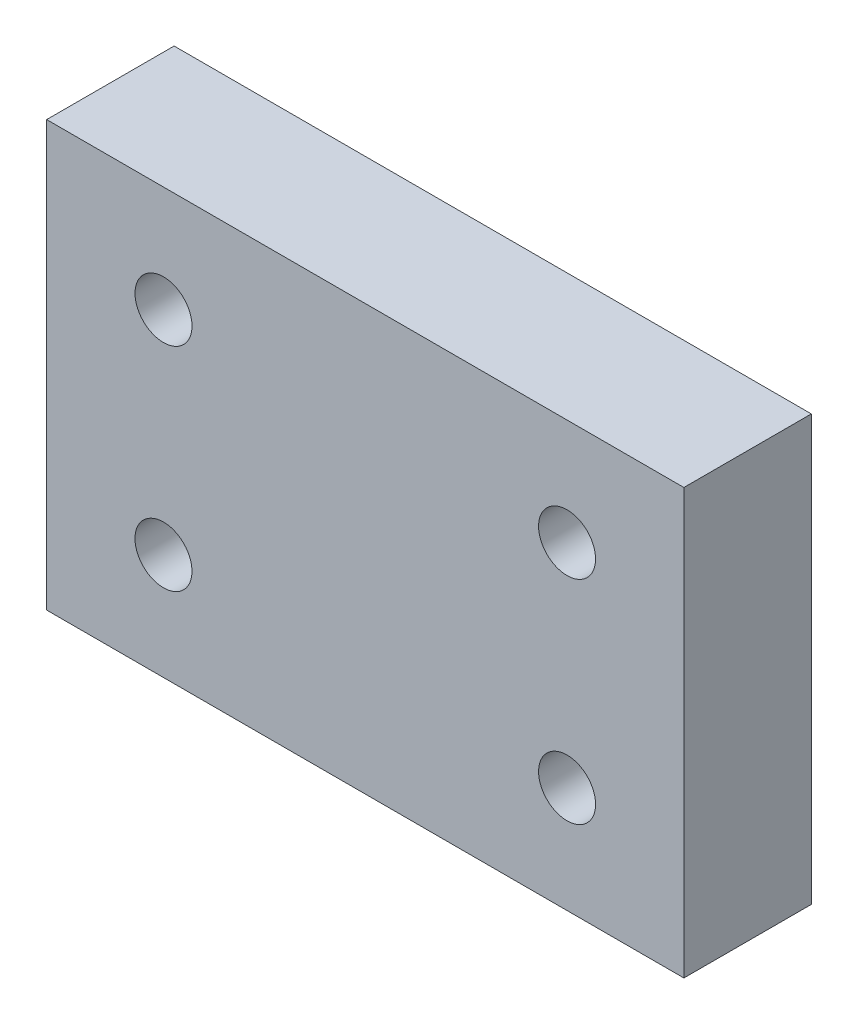
ISO-10303-21;
HEADER;
FILE_DESCRIPTION(('STEP AP214'),'2;1');
FILE_NAME('part.step','',(''),(''),'','','');
FILE_SCHEMA(('AUTOMOTIVE_DESIGN { 1 0 10303 214 1 1 1 1 }'));
ENDSEC;
DATA;
#1=APPLICATION_CONTEXT('core data for automotive mechanical design processes');
#2=APPLICATION_PROTOCOL_DEFINITION('international standard','automotive_design',2000,#1);
#3=PRODUCT_CONTEXT('',#1,'mechanical');
#4=PRODUCT('Part','Part','',(#3));
#5=PRODUCT_RELATED_PRODUCT_CATEGORY('part','',(#4));
#6=PRODUCT_DEFINITION_FORMATION('','',#4);
#7=PRODUCT_DEFINITION_CONTEXT('part definition',#1,'design');
#8=PRODUCT_DEFINITION('design','',#6,#7);
#9=PRODUCT_DEFINITION_SHAPE('','',#8);
#10=(LENGTH_UNIT() NAMED_UNIT(*) SI_UNIT(.MILLI.,.METRE.));
#11=(NAMED_UNIT(*) PLANE_ANGLE_UNIT() SI_UNIT($,.RADIAN.));
#12=(NAMED_UNIT(*) SI_UNIT($,.STERADIAN.) SOLID_ANGLE_UNIT());
#13=UNCERTAINTY_MEASURE_WITH_UNIT(LENGTH_MEASURE(1.E-05),#10,'distance_accuracy_value','');
#14=(GEOMETRIC_REPRESENTATION_CONTEXT(3) GLOBAL_UNCERTAINTY_ASSIGNED_CONTEXT((#13)) GLOBAL_UNIT_ASSIGNED_CONTEXT((#10,
#11,#12)) REPRESENTATION_CONTEXT('',''));
#15=CARTESIAN_POINT('',(0.,0.,0.));
#16=DIRECTION('',(0.,0.,1.));
#17=DIRECTION('',(1.,0.,0.));
#18=AXIS2_PLACEMENT_3D('',#15,#16,#17);
#19=CARTESIAN_POINT('',(0.,0.,6.));
#20=DIRECTION('',(0.,0.,-1.));
#21=DIRECTION('',(-1.,0.,0.));
#22=AXIS2_PLACEMENT_3D('',#19,#20,#21);
#23=PLANE('',#22);
#24=CARTESIAN_POINT('',(24.5,5.,6.));
#25=DIRECTION('',(0.,0.,1.));
#26=DIRECTION('',(1.,0.,0.));
#27=AXIS2_PLACEMENT_3D('',#24,#25,#26);
#28=CIRCLE('',#27,1.34180855128207);
#29=CARTESIAN_POINT('',(25.8418085512821,5.,6.));
#30=VERTEX_POINT('',#29);
#31=EDGE_CURVE('E121',#30,#30,#28,.T.);
#32=ORIENTED_EDGE('',*,*,#31,.F.);
#33=EDGE_LOOP('',(#32));
#34=FACE_BOUND('',#33,.T.);
#35=CARTESIAN_POINT('',(5.5,15.,6.));
#36=DIRECTION('',(0.,0.,1.));
#37=DIRECTION('',(1.,0.,0.));
#38=AXIS2_PLACEMENT_3D('',#35,#36,#37);
#39=CIRCLE('',#38,1.34180855128207);
#40=CARTESIAN_POINT('',(6.84180855128207,15.,6.));
#41=VERTEX_POINT('',#40);
#42=EDGE_CURVE('E100',#41,#41,#39,.T.);
#43=ORIENTED_EDGE('',*,*,#42,.F.);
#44=EDGE_LOOP('',(#43));
#45=FACE_BOUND('',#44,.T.);
#46=DIRECTION('',(0.,-1.,0.));
#47=VECTOR('',#46,1.);
#48=CARTESIAN_POINT('',(0.,0.,6.));
#49=LINE('',#48,#47);
#50=CARTESIAN_POINT('',(0.,20.,6.));
#51=VERTEX_POINT('',#50);
#52=CARTESIAN_POINT('',(0.,0.,6.));
#53=VERTEX_POINT('',#52);
#54=EDGE_CURVE('E85',#51,#53,#49,.T.);
#55=ORIENTED_EDGE('',*,*,#54,.T.);
#56=DIRECTION('',(1.,0.,0.));
#57=VECTOR('',#56,1.);
#58=CARTESIAN_POINT('',(0.,0.,6.));
#59=LINE('',#58,#57);
#60=CARTESIAN_POINT('',(30.,0.,6.));
#61=VERTEX_POINT('',#60);
#62=EDGE_CURVE('E80',#53,#61,#59,.T.);
#63=ORIENTED_EDGE('',*,*,#62,.T.);
#64=DIRECTION('',(0.,1.,0.));
#65=VECTOR('',#64,1.);
#66=CARTESIAN_POINT('',(30.,0.,6.));
#67=LINE('',#66,#65);
#68=CARTESIAN_POINT('',(30.,20.,6.));
#69=VERTEX_POINT('',#68);
#70=EDGE_CURVE('E83',#61,#69,#67,.T.);
#71=ORIENTED_EDGE('',*,*,#70,.T.);
#72=DIRECTION('',(-1.,0.,0.));
#73=VECTOR('',#72,1.);
#74=CARTESIAN_POINT('',(0.,20.,6.));
#75=LINE('',#74,#73);
#76=EDGE_CURVE('E50',#69,#51,#75,.T.);
#77=ORIENTED_EDGE('',*,*,#76,.T.);
#78=EDGE_LOOP('',(#55,#63,#71,#77));
#79=FACE_BOUND('',#78,.T.);
#80=CARTESIAN_POINT('',(24.5,15.,6.));
#81=DIRECTION('',(0.,0.,1.));
#82=DIRECTION('',(-1.,0.,0.));
#83=AXIS2_PLACEMENT_3D('',#80,#81,#82);
#84=CIRCLE('',#83,1.34180855128207);
#85=CARTESIAN_POINT('',(23.1581914487179,15.,6.));
#86=VERTEX_POINT('',#85);
#87=EDGE_CURVE('E115',#86,#86,#84,.T.);
#88=ORIENTED_EDGE('',*,*,#87,.F.);
#89=EDGE_LOOP('',(#88));
#90=FACE_BOUND('',#89,.T.);
#91=CARTESIAN_POINT('',(5.5,5.,6.));
#92=DIRECTION('',(0.,0.,1.));
#93=DIRECTION('',(-1.,0.,0.));
#94=AXIS2_PLACEMENT_3D('',#91,#92,#93);
#95=CIRCLE('',#94,1.34180855128207);
#96=CARTESIAN_POINT('',(4.15819144871793,5.,6.));
#97=VERTEX_POINT('',#96);
#98=EDGE_CURVE('E127',#97,#97,#95,.T.);
#99=ORIENTED_EDGE('',*,*,#98,.F.);
#100=EDGE_LOOP('',(#99));
#101=FACE_BOUND('',#100,.T.);
#102=ADVANCED_FACE('F33',(#34,#45,#79,#90,#101),#23,.F.);
#103=CARTESIAN_POINT('',(0.,0.,0.));
#104=DIRECTION('',(0.,0.,-1.));
#105=DIRECTION('',(-1.,0.,0.));
#106=AXIS2_PLACEMENT_3D('',#103,#104,#105);
#107=PLANE('',#106);
#108=CARTESIAN_POINT('',(24.5,5.,0.));
#109=DIRECTION('',(0.,0.,1.));
#110=DIRECTION('',(1.,0.,0.));
#111=AXIS2_PLACEMENT_3D('',#108,#109,#110);
#112=CIRCLE('',#111,1.34180855128207);
#113=CARTESIAN_POINT('',(25.8418085512821,5.,0.));
#114=VERTEX_POINT('',#113);
#115=EDGE_CURVE('E124',#114,#114,#112,.T.);
#116=ORIENTED_EDGE('',*,*,#115,.T.);
#117=EDGE_LOOP('',(#116));
#118=FACE_BOUND('',#117,.T.);
#119=CARTESIAN_POINT('',(5.5,15.,0.));
#120=DIRECTION('',(0.,0.,1.));
#121=DIRECTION('',(1.,0.,0.));
#122=AXIS2_PLACEMENT_3D('',#119,#120,#121);
#123=CIRCLE('',#122,1.34180855128207);
#124=CARTESIAN_POINT('',(6.84180855128207,15.,0.));
#125=VERTEX_POINT('',#124);
#126=EDGE_CURVE('E112',#125,#125,#123,.T.);
#127=ORIENTED_EDGE('',*,*,#126,.T.);
#128=EDGE_LOOP('',(#127));
#129=FACE_BOUND('',#128,.T.);
#130=DIRECTION('',(0.,-1.,0.));
#131=VECTOR('',#130,1.);
#132=CARTESIAN_POINT('',(0.,0.,0.));
#133=LINE('',#132,#131);
#134=CARTESIAN_POINT('',(0.,20.,0.));
#135=VERTEX_POINT('',#134);
#136=CARTESIAN_POINT('',(0.,0.,0.));
#137=VERTEX_POINT('',#136);
#138=EDGE_CURVE('E97',#135,#137,#133,.T.);
#139=ORIENTED_EDGE('',*,*,#138,.F.);
#140=DIRECTION('',(-1.,0.,0.));
#141=VECTOR('',#140,1.);
#142=CARTESIAN_POINT('',(0.,20.,0.));
#143=LINE('',#142,#141);
#144=CARTESIAN_POINT('',(30.,20.,0.));
#145=VERTEX_POINT('',#144);
#146=EDGE_CURVE('E73',#145,#135,#143,.T.);
#147=ORIENTED_EDGE('',*,*,#146,.F.);
#148=DIRECTION('',(0.,1.,0.));
#149=VECTOR('',#148,1.);
#150=CARTESIAN_POINT('',(30.,0.,0.));
#151=LINE('',#150,#149);
#152=CARTESIAN_POINT('',(30.,0.,0.));
#153=VERTEX_POINT('',#152);
#154=EDGE_CURVE('E67',#153,#145,#151,.T.);
#155=ORIENTED_EDGE('',*,*,#154,.F.);
#156=DIRECTION('',(1.,0.,0.));
#157=VECTOR('',#156,1.);
#158=CARTESIAN_POINT('',(0.,0.,0.));
#159=LINE('',#158,#157);
#160=EDGE_CURVE('E89',#137,#153,#159,.T.);
#161=ORIENTED_EDGE('',*,*,#160,.F.);
#162=EDGE_LOOP('',(#139,#147,#155,#161));
#163=FACE_BOUND('',#162,.T.);
#164=CARTESIAN_POINT('',(24.5,15.,0.));
#165=DIRECTION('',(0.,0.,1.));
#166=DIRECTION('',(-1.,0.,0.));
#167=AXIS2_PLACEMENT_3D('',#164,#165,#166);
#168=CIRCLE('',#167,1.34180855128207);
#169=CARTESIAN_POINT('',(23.1581914487179,15.,0.));
#170=VERTEX_POINT('',#169);
#171=EDGE_CURVE('E118',#170,#170,#168,.T.);
#172=ORIENTED_EDGE('',*,*,#171,.T.);
#173=EDGE_LOOP('',(#172));
#174=FACE_BOUND('',#173,.T.);
#175=CARTESIAN_POINT('',(5.5,5.,0.));
#176=DIRECTION('',(0.,0.,1.));
#177=DIRECTION('',(-1.,0.,0.));
#178=AXIS2_PLACEMENT_3D('',#175,#176,#177);
#179=CIRCLE('',#178,1.34180855128207);
#180=CARTESIAN_POINT('',(4.15819144871793,5.,0.));
#181=VERTEX_POINT('',#180);
#182=EDGE_CURVE('E130',#181,#181,#179,.T.);
#183=ORIENTED_EDGE('',*,*,#182,.T.);
#184=EDGE_LOOP('',(#183));
#185=FACE_BOUND('',#184,.T.);
#186=ADVANCED_FACE('F108',(#118,#129,#163,#174,#185),#107,.T.);
#187=CARTESIAN_POINT('',(0.,0.,6.));
#188=DIRECTION('',(1.,0.,0.));
#189=DIRECTION('',(0.,0.,-1.));
#190=AXIS2_PLACEMENT_3D('',#187,#188,#189);
#191=PLANE('',#190);
#192=ORIENTED_EDGE('',*,*,#138,.T.);
#193=DIRECTION('',(0.,0.,-1.));
#194=VECTOR('',#193,1.);
#195=CARTESIAN_POINT('',(0.,0.,6.));
#196=LINE('',#195,#194);
#197=EDGE_CURVE('E11',#53,#137,#196,.T.);
#198=ORIENTED_EDGE('',*,*,#197,.F.);
#199=ORIENTED_EDGE('',*,*,#54,.F.);
#200=DIRECTION('',(0.,0.,-1.));
#201=VECTOR('',#200,1.);
#202=CARTESIAN_POINT('',(0.,20.,6.));
#203=LINE('',#202,#201);
#204=EDGE_CURVE('E93',#51,#135,#203,.T.);
#205=ORIENTED_EDGE('',*,*,#204,.T.);
#206=EDGE_LOOP('',(#192,#198,#199,#205));
#207=FACE_BOUND('',#206,.T.);
#208=ADVANCED_FACE('F35',(#207),#191,.F.);
#209=CARTESIAN_POINT('',(0.,0.,6.));
#210=DIRECTION('',(0.,1.,0.));
#211=DIRECTION('',(0.,0.,1.));
#212=AXIS2_PLACEMENT_3D('',#209,#210,#211);
#213=PLANE('',#212);
#214=ORIENTED_EDGE('',*,*,#160,.T.);
#215=DIRECTION('',(0.,0.,-1.));
#216=VECTOR('',#215,1.);
#217=CARTESIAN_POINT('',(30.,0.,6.));
#218=LINE('',#217,#216);
#219=EDGE_CURVE('E42',#61,#153,#218,.T.);
#220=ORIENTED_EDGE('',*,*,#219,.F.);
#221=ORIENTED_EDGE('',*,*,#62,.F.);
#222=ORIENTED_EDGE('',*,*,#197,.T.);
#223=EDGE_LOOP('',(#214,#220,#221,#222));
#224=FACE_BOUND('',#223,.T.);
#225=ADVANCED_FACE('F88',(#224),#213,.F.);
#226=CARTESIAN_POINT('',(30.,0.,6.));
#227=DIRECTION('',(-1.,0.,0.));
#228=DIRECTION('',(0.,0.,1.));
#229=AXIS2_PLACEMENT_3D('',#226,#227,#228);
#230=PLANE('',#229);
#231=ORIENTED_EDGE('',*,*,#154,.T.);
#232=DIRECTION('',(0.,0.,-1.));
#233=VECTOR('',#232,1.);
#234=CARTESIAN_POINT('',(30.,20.,6.));
#235=LINE('',#234,#233);
#236=EDGE_CURVE('E90',#69,#145,#235,.T.);
#237=ORIENTED_EDGE('',*,*,#236,.F.);
#238=ORIENTED_EDGE('',*,*,#70,.F.);
#239=ORIENTED_EDGE('',*,*,#219,.T.);
#240=EDGE_LOOP('',(#231,#237,#238,#239));
#241=FACE_BOUND('',#240,.T.);
#242=ADVANCED_FACE('F91',(#241),#230,.F.);
#243=CARTESIAN_POINT('',(0.,20.,6.));
#244=DIRECTION('',(0.,-1.,0.));
#245=DIRECTION('',(0.,0.,-1.));
#246=AXIS2_PLACEMENT_3D('',#243,#244,#245);
#247=PLANE('',#246);
#248=ORIENTED_EDGE('',*,*,#146,.T.);
#249=ORIENTED_EDGE('',*,*,#204,.F.);
#250=ORIENTED_EDGE('',*,*,#76,.F.);
#251=ORIENTED_EDGE('',*,*,#236,.T.);
#252=EDGE_LOOP('',(#248,#249,#250,#251));
#253=FACE_BOUND('',#252,.T.);
#254=ADVANCED_FACE('F105',(#253),#247,.F.);
#255=CARTESIAN_POINT('',(5.5,15.,6.));
#256=DIRECTION('',(0.,0.,-1.));
#257=DIRECTION('',(-1.,0.,0.));
#258=AXIS2_PLACEMENT_3D('',#255,#256,#257);
#259=CYLINDRICAL_SURFACE('',#258,1.34180855128207);
#260=ORIENTED_EDGE('',*,*,#42,.T.);
#261=EDGE_LOOP('',(#260));
#262=FACE_BOUND('',#261,.T.);
#263=ORIENTED_EDGE('',*,*,#126,.F.);
#264=EDGE_LOOP('',(#263));
#265=FACE_BOUND('',#264,.T.);
#266=ADVANCED_FACE('F150',(#262,#265),#259,.F.);
#267=CARTESIAN_POINT('',(24.5,15.,6.));
#268=DIRECTION('',(0.,0.,-1.));
#269=DIRECTION('',(-1.,0.,0.));
#270=AXIS2_PLACEMENT_3D('',#267,#268,#269);
#271=CYLINDRICAL_SURFACE('',#270,1.34180855128207);
#272=ORIENTED_EDGE('',*,*,#87,.T.);
#273=EDGE_LOOP('',(#272));
#274=FACE_BOUND('',#273,.T.);
#275=ORIENTED_EDGE('',*,*,#171,.F.);
#276=EDGE_LOOP('',(#275));
#277=FACE_BOUND('',#276,.T.);
#278=ADVANCED_FACE('F196',(#274,#277),#271,.F.);
#279=CARTESIAN_POINT('',(24.5,5.,6.));
#280=DIRECTION('',(0.,0.,-1.));
#281=DIRECTION('',(-1.,0.,0.));
#282=AXIS2_PLACEMENT_3D('',#279,#280,#281);
#283=CYLINDRICAL_SURFACE('',#282,1.34180855128207);
#284=ORIENTED_EDGE('',*,*,#31,.T.);
#285=EDGE_LOOP('',(#284));
#286=FACE_BOUND('',#285,.T.);
#287=ORIENTED_EDGE('',*,*,#115,.F.);
#288=EDGE_LOOP('',(#287));
#289=FACE_BOUND('',#288,.T.);
#290=ADVANCED_FACE('F204',(#286,#289),#283,.F.);
#291=CARTESIAN_POINT('',(5.5,5.,6.));
#292=DIRECTION('',(0.,0.,-1.));
#293=DIRECTION('',(-1.,0.,0.));
#294=AXIS2_PLACEMENT_3D('',#291,#292,#293);
#295=CYLINDRICAL_SURFACE('',#294,1.34180855128207);
#296=ORIENTED_EDGE('',*,*,#98,.T.);
#297=EDGE_LOOP('',(#296));
#298=FACE_BOUND('',#297,.T.);
#299=ORIENTED_EDGE('',*,*,#182,.F.);
#300=EDGE_LOOP('',(#299));
#301=FACE_BOUND('',#300,.T.);
#302=ADVANCED_FACE('F136',(#298,#301),#295,.F.);
#303=CLOSED_SHELL('',(#102,#186,#208,#225,#242,#254,#266,#278,#290,#302));
#304=MANIFOLD_SOLID_BREP('B2',#303);
#305=ADVANCED_BREP_SHAPE_REPRESENTATION('',(#18,#304),#14);
#306=SHAPE_DEFINITION_REPRESENTATION(#9,#305);
ENDSEC;
END-ISO-10303-21;
